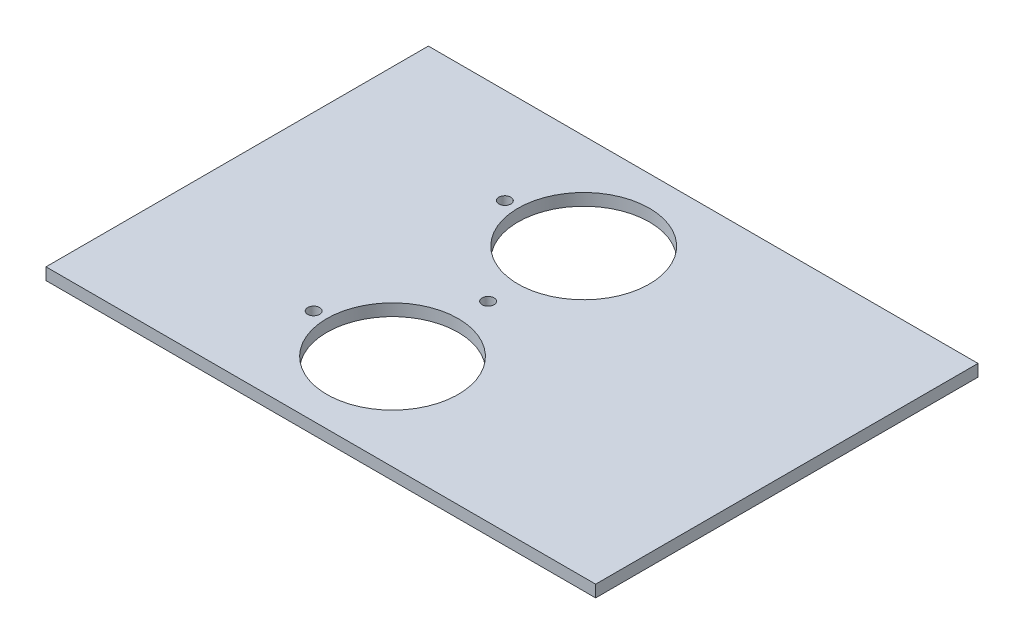
ISO-10303-21;
HEADER;
FILE_DESCRIPTION(('STEP AP214'),'2;1');
FILE_NAME('part.step','',(''),(''),'','','');
FILE_SCHEMA(('AUTOMOTIVE_DESIGN { 1 0 10303 214 1 1 1 1 }'));
ENDSEC;
DATA;
#1=APPLICATION_CONTEXT('core data for automotive mechanical design processes');
#2=APPLICATION_PROTOCOL_DEFINITION('international standard','automotive_design',2000,#1);
#3=PRODUCT_CONTEXT('',#1,'mechanical');
#4=PRODUCT('Part','Part','',(#3));
#5=PRODUCT_RELATED_PRODUCT_CATEGORY('part','',(#4));
#6=PRODUCT_DEFINITION_FORMATION('','',#4);
#7=PRODUCT_DEFINITION_CONTEXT('part definition',#1,'design');
#8=PRODUCT_DEFINITION('design','',#6,#7);
#9=PRODUCT_DEFINITION_SHAPE('','',#8);
#10=(LENGTH_UNIT() NAMED_UNIT(*) SI_UNIT(.MILLI.,.METRE.));
#11=(NAMED_UNIT(*) PLANE_ANGLE_UNIT() SI_UNIT($,.RADIAN.));
#12=(NAMED_UNIT(*) SI_UNIT($,.STERADIAN.) SOLID_ANGLE_UNIT());
#13=UNCERTAINTY_MEASURE_WITH_UNIT(LENGTH_MEASURE(1.E-05),#10,'distance_accuracy_value','');
#14=(GEOMETRIC_REPRESENTATION_CONTEXT(3) GLOBAL_UNCERTAINTY_ASSIGNED_CONTEXT((#13)) GLOBAL_UNIT_ASSIGNED_CONTEXT((#10,
#11,#12)) REPRESENTATION_CONTEXT('',''));
#15=CARTESIAN_POINT('',(0.,0.,0.));
#16=DIRECTION('',(0.,0.,1.));
#17=DIRECTION('',(1.,0.,0.));
#18=AXIS2_PLACEMENT_3D('',#15,#16,#17);
#19=CARTESIAN_POINT('',(125.,5.,80.));
#20=DIRECTION('',(-1.,0.,0.));
#21=DIRECTION('',(0.,0.,1.));
#22=AXIS2_PLACEMENT_3D('',#19,#20,#21);
#23=PLANE('',#22);
#24=DIRECTION('',(0.,0.,-1.));
#25=VECTOR('',#24,1.);
#26=CARTESIAN_POINT('',(125.,0.,80.));
#27=LINE('',#26,#25);
#28=CARTESIAN_POINT('',(125.,0.,80.));
#29=VERTEX_POINT('',#28);
#30=CARTESIAN_POINT('',(125.,0.,-80.));
#31=VERTEX_POINT('',#30);
#32=EDGE_CURVE('E91',#29,#31,#27,.T.);
#33=ORIENTED_EDGE('',*,*,#32,.T.);
#34=DIRECTION('',(0.,-1.,0.));
#35=VECTOR('',#34,1.);
#36=CARTESIAN_POINT('',(125.,5.,-80.));
#37=LINE('',#36,#35);
#38=CARTESIAN_POINT('',(125.,5.,-80.));
#39=VERTEX_POINT('',#38);
#40=EDGE_CURVE('E11',#39,#31,#37,.T.);
#41=ORIENTED_EDGE('',*,*,#40,.F.);
#42=DIRECTION('',(0.,0.,-1.));
#43=VECTOR('',#42,1.);
#44=CARTESIAN_POINT('',(125.,5.,80.));
#45=LINE('',#44,#43);
#46=CARTESIAN_POINT('',(125.,5.,80.));
#47=VERTEX_POINT('',#46);
#48=EDGE_CURVE('E85',#47,#39,#45,.T.);
#49=ORIENTED_EDGE('',*,*,#48,.F.);
#50=DIRECTION('',(0.,-1.,0.));
#51=VECTOR('',#50,1.);
#52=CARTESIAN_POINT('',(125.,5.,80.));
#53=LINE('',#52,#51);
#54=EDGE_CURVE('E46',#47,#29,#53,.T.);
#55=ORIENTED_EDGE('',*,*,#54,.T.);
#56=EDGE_LOOP('',(#33,#41,#49,#55));
#57=FACE_BOUND('',#56,.T.);
#58=ADVANCED_FACE('F39',(#57),#23,.F.);
#59=CARTESIAN_POINT('',(-125.,5.,-80.));
#60=DIRECTION('',(0.,0.,1.));
#61=DIRECTION('',(1.,0.,0.));
#62=AXIS2_PLACEMENT_3D('',#59,#60,#61);
#63=PLANE('',#62);
#64=DIRECTION('',(-1.,0.,0.));
#65=VECTOR('',#64,1.);
#66=CARTESIAN_POINT('',(-125.,0.,-80.));
#67=LINE('',#66,#65);
#68=CARTESIAN_POINT('',(-105.,0.,-80.));
#69=VERTEX_POINT('',#68);
#70=EDGE_CURVE('E86',#31,#69,#67,.T.);
#71=ORIENTED_EDGE('',*,*,#70,.T.);
#72=DIRECTION('',(0.,-1.,0.));
#73=VECTOR('',#72,1.);
#74=CARTESIAN_POINT('',(-105.,5.001,-80.));
#75=LINE('',#74,#73);
#76=CARTESIAN_POINT('',(-105.,5.,-80.));
#77=VERTEX_POINT('',#76);
#78=EDGE_CURVE('E53',#77,#69,#75,.T.);
#79=ORIENTED_EDGE('',*,*,#78,.F.);
#80=DIRECTION('',(-1.,0.,0.));
#81=VECTOR('',#80,1.);
#82=CARTESIAN_POINT('',(-125.,5.,-80.));
#83=LINE('',#82,#81);
#84=EDGE_CURVE('E103',#39,#77,#83,.T.);
#85=ORIENTED_EDGE('',*,*,#84,.F.);
#86=ORIENTED_EDGE('',*,*,#40,.T.);
#87=EDGE_LOOP('',(#71,#79,#85,#86));
#88=FACE_BOUND('',#87,.T.);
#89=ADVANCED_FACE('F151',(#88),#63,.F.);
#90=CARTESIAN_POINT('',(-125.,5.,80.));
#91=DIRECTION('',(0.,0.,-1.));
#92=DIRECTION('',(-1.,0.,0.));
#93=AXIS2_PLACEMENT_3D('',#90,#91,#92);
#94=PLANE('',#93);
#95=DIRECTION('',(1.,0.,0.));
#96=VECTOR('',#95,1.);
#97=CARTESIAN_POINT('',(-125.,5.,80.));
#98=LINE('',#97,#96);
#99=CARTESIAN_POINT('',(-105.,5.,80.));
#100=VERTEX_POINT('',#99);
#101=EDGE_CURVE('E62',#100,#47,#98,.T.);
#102=ORIENTED_EDGE('',*,*,#101,.F.);
#103=DIRECTION('',(0.,-1.,0.));
#104=VECTOR('',#103,1.);
#105=CARTESIAN_POINT('',(-105.,5.001,80.));
#106=LINE('',#105,#104);
#107=CARTESIAN_POINT('',(-105.,0.,80.));
#108=VERTEX_POINT('',#107);
#109=EDGE_CURVE('E82',#100,#108,#106,.T.);
#110=ORIENTED_EDGE('',*,*,#109,.T.);
#111=DIRECTION('',(1.,0.,0.));
#112=VECTOR('',#111,1.);
#113=CARTESIAN_POINT('',(-125.,0.,80.));
#114=LINE('',#113,#112);
#115=EDGE_CURVE('E76',#108,#29,#114,.T.);
#116=ORIENTED_EDGE('',*,*,#115,.T.);
#117=ORIENTED_EDGE('',*,*,#54,.F.);
#118=EDGE_LOOP('',(#102,#110,#116,#117));
#119=FACE_BOUND('',#118,.T.);
#120=ADVANCED_FACE('F78',(#119),#94,.F.);
#121=CARTESIAN_POINT('',(0.,5.,0.));
#122=DIRECTION('',(0.,-1.,0.));
#123=DIRECTION('',(0.,0.,-1.));
#124=AXIS2_PLACEMENT_3D('',#121,#122,#123);
#125=PLANE('',#124);
#126=CARTESIAN_POINT('',(0.,5.,40.));
#127=DIRECTION('',(0.,-1.,0.));
#128=DIRECTION('',(0.,0.,-1.));
#129=AXIS2_PLACEMENT_3D('',#126,#127,#128);
#130=CIRCLE('',#129,27.5);
#131=CARTESIAN_POINT('',(0.,5.,12.5));
#132=VERTEX_POINT('',#131);
#133=EDGE_CURVE('E126',#132,#132,#130,.F.);
#134=ORIENTED_EDGE('',*,*,#133,.F.);
#135=EDGE_LOOP('',(#134));
#136=FACE_BOUND('',#135,.T.);
#137=CARTESIAN_POINT('',(-32.9999999999999,5.,40.));
#138=DIRECTION('',(0.,-1.,0.));
#139=DIRECTION('',(0.,0.,-1.));
#140=AXIS2_PLACEMENT_3D('',#137,#138,#139);
#141=CIRCLE('',#140,2.5);
#142=CARTESIAN_POINT('',(-32.9999999999999,5.,37.5));
#143=VERTEX_POINT('',#142);
#144=EDGE_CURVE('E125',#143,#143,#141,.F.);
#145=ORIENTED_EDGE('',*,*,#144,.F.);
#146=EDGE_LOOP('',(#145));
#147=FACE_BOUND('',#146,.T.);
#148=CARTESIAN_POINT('',(-33.,5.,-40.));
#149=DIRECTION('',(0.,-1.,0.));
#150=DIRECTION('',(0.,0.,-1.));
#151=AXIS2_PLACEMENT_3D('',#148,#149,#150);
#152=CIRCLE('',#151,2.5);
#153=CARTESIAN_POINT('',(-33.,5.,-42.5));
#154=VERTEX_POINT('',#153);
#155=EDGE_CURVE('E112',#154,#154,#152,.F.);
#156=ORIENTED_EDGE('',*,*,#155,.F.);
#157=EDGE_LOOP('',(#156));
#158=FACE_BOUND('',#157,.T.);
#159=CARTESIAN_POINT('',(0.,5.,0.));
#160=DIRECTION('',(0.,-1.,0.));
#161=DIRECTION('',(0.,0.,-1.));
#162=AXIS2_PLACEMENT_3D('',#159,#160,#161);
#163=CIRCLE('',#162,2.5);
#164=CARTESIAN_POINT('',(0.,5.,-2.5));
#165=VERTEX_POINT('',#164);
#166=EDGE_CURVE('E136',#165,#165,#163,.F.);
#167=ORIENTED_EDGE('',*,*,#166,.F.);
#168=EDGE_LOOP('',(#167));
#169=FACE_BOUND('',#168,.T.);
#170=CARTESIAN_POINT('',(0.,5.,-40.));
#171=DIRECTION('',(0.,-1.,0.));
#172=DIRECTION('',(0.,0.,-1.));
#173=AXIS2_PLACEMENT_3D('',#170,#171,#172);
#174=CIRCLE('',#173,27.5);
#175=CARTESIAN_POINT('',(0.,5.,-67.5));
#176=VERTEX_POINT('',#175);
#177=EDGE_CURVE('E95',#176,#176,#174,.F.);
#178=ORIENTED_EDGE('',*,*,#177,.F.);
#179=EDGE_LOOP('',(#178));
#180=FACE_BOUND('',#179,.T.);
#181=ORIENTED_EDGE('',*,*,#84,.T.);
#182=DIRECTION('',(0.,0.,-1.));
#183=VECTOR('',#182,1.);
#184=CARTESIAN_POINT('',(-105.,5.,-80.));
#185=LINE('',#184,#183);
#186=EDGE_CURVE('E110',#100,#77,#185,.T.);
#187=ORIENTED_EDGE('',*,*,#186,.F.);
#188=ORIENTED_EDGE('',*,*,#101,.T.);
#189=ORIENTED_EDGE('',*,*,#48,.T.);
#190=EDGE_LOOP('',(#181,#187,#188,#189));
#191=FACE_BOUND('',#190,.T.);
#192=ADVANCED_FACE('F142',(#136,#147,#158,#169,#180,#191),#125,.F.);
#193=CARTESIAN_POINT('',(0.,0.,0.));
#194=DIRECTION('',(0.,-1.,0.));
#195=DIRECTION('',(0.,0.,-1.));
#196=AXIS2_PLACEMENT_3D('',#193,#194,#195);
#197=PLANE('',#196);
#198=CARTESIAN_POINT('',(0.,0.,40.));
#199=DIRECTION('',(0.,-1.,0.));
#200=DIRECTION('',(0.,0.,1.));
#201=AXIS2_PLACEMENT_3D('',#198,#199,#200);
#202=CIRCLE('',#201,27.5);
#203=CARTESIAN_POINT('',(0.,0.,67.5));
#204=VERTEX_POINT('',#203);
#205=EDGE_CURVE('E122',#204,#204,#202,.T.);
#206=ORIENTED_EDGE('',*,*,#205,.F.);
#207=EDGE_LOOP('',(#206));
#208=FACE_BOUND('',#207,.T.);
#209=CARTESIAN_POINT('',(-32.9999999999999,0.,40.));
#210=DIRECTION('',(0.,-1.,0.));
#211=DIRECTION('',(0.,0.,1.));
#212=AXIS2_PLACEMENT_3D('',#209,#210,#211);
#213=CIRCLE('',#212,2.5);
#214=CARTESIAN_POINT('',(-32.9999999999999,0.,42.5));
#215=VERTEX_POINT('',#214);
#216=EDGE_CURVE('E116',#215,#215,#213,.T.);
#217=ORIENTED_EDGE('',*,*,#216,.F.);
#218=EDGE_LOOP('',(#217));
#219=FACE_BOUND('',#218,.T.);
#220=DIRECTION('',(0.,0.,1.));
#221=VECTOR('',#220,1.);
#222=CARTESIAN_POINT('',(-105.,0.,-80.));
#223=LINE('',#222,#221);
#224=EDGE_CURVE('E113',#69,#108,#223,.T.);
#225=ORIENTED_EDGE('',*,*,#224,.F.);
#226=ORIENTED_EDGE('',*,*,#70,.F.);
#227=ORIENTED_EDGE('',*,*,#32,.F.);
#228=ORIENTED_EDGE('',*,*,#115,.F.);
#229=EDGE_LOOP('',(#225,#226,#227,#228));
#230=FACE_BOUND('',#229,.T.);
#231=CARTESIAN_POINT('',(-33.,0.,-40.));
#232=DIRECTION('',(0.,-1.,0.));
#233=DIRECTION('',(0.,0.,-1.));
#234=AXIS2_PLACEMENT_3D('',#231,#232,#233);
#235=CIRCLE('',#234,2.5);
#236=CARTESIAN_POINT('',(-33.,0.,-42.5));
#237=VERTEX_POINT('',#236);
#238=EDGE_CURVE('E109',#237,#237,#235,.T.);
#239=ORIENTED_EDGE('',*,*,#238,.F.);
#240=EDGE_LOOP('',(#239));
#241=FACE_BOUND('',#240,.T.);
#242=CARTESIAN_POINT('',(0.,0.,0.));
#243=DIRECTION('',(0.,-1.,0.));
#244=DIRECTION('',(0.,0.,-1.));
#245=AXIS2_PLACEMENT_3D('',#242,#243,#244);
#246=CIRCLE('',#245,2.5);
#247=CARTESIAN_POINT('',(0.,0.,-2.5));
#248=VERTEX_POINT('',#247);
#249=EDGE_CURVE('E129',#248,#248,#246,.T.);
#250=ORIENTED_EDGE('',*,*,#249,.F.);
#251=EDGE_LOOP('',(#250));
#252=FACE_BOUND('',#251,.T.);
#253=CARTESIAN_POINT('',(0.,0.,-40.));
#254=DIRECTION('',(0.,-1.,0.));
#255=DIRECTION('',(0.,0.,-1.));
#256=AXIS2_PLACEMENT_3D('',#253,#254,#255);
#257=CIRCLE('',#256,27.5);
#258=CARTESIAN_POINT('',(0.,0.,-67.5));
#259=VERTEX_POINT('',#258);
#260=EDGE_CURVE('E99',#259,#259,#257,.T.);
#261=ORIENTED_EDGE('',*,*,#260,.F.);
#262=EDGE_LOOP('',(#261));
#263=FACE_BOUND('',#262,.T.);
#264=ADVANCED_FACE('F92',(#208,#219,#230,#241,#252,#263),#197,.T.);
#265=CARTESIAN_POINT('',(0.,5.001,-40.));
#266=DIRECTION('',(0.,-1.,0.));
#267=DIRECTION('',(0.,0.,-1.));
#268=AXIS2_PLACEMENT_3D('',#265,#266,#267);
#269=CYLINDRICAL_SURFACE('',#268,27.5);
#270=ORIENTED_EDGE('',*,*,#260,.T.);
#271=EDGE_LOOP('',(#270));
#272=FACE_BOUND('',#271,.T.);
#273=ORIENTED_EDGE('',*,*,#177,.T.);
#274=EDGE_LOOP('',(#273));
#275=FACE_BOUND('',#274,.T.);
#276=ADVANCED_FACE('F160',(#272,#275),#269,.F.);
#277=CARTESIAN_POINT('',(0.,5.001,0.));
#278=DIRECTION('',(0.,-1.,0.));
#279=DIRECTION('',(0.,0.,-1.));
#280=AXIS2_PLACEMENT_3D('',#277,#278,#279);
#281=CYLINDRICAL_SURFACE('',#280,2.5);
#282=ORIENTED_EDGE('',*,*,#249,.T.);
#283=EDGE_LOOP('',(#282));
#284=FACE_BOUND('',#283,.T.);
#285=ORIENTED_EDGE('',*,*,#166,.T.);
#286=EDGE_LOOP('',(#285));
#287=FACE_BOUND('',#286,.T.);
#288=ADVANCED_FACE('F140',(#284,#287),#281,.F.);
#289=CARTESIAN_POINT('',(-33.,5.001,-40.));
#290=DIRECTION('',(0.,-1.,0.));
#291=DIRECTION('',(0.,0.,-1.));
#292=AXIS2_PLACEMENT_3D('',#289,#290,#291);
#293=CYLINDRICAL_SURFACE('',#292,2.5);
#294=ORIENTED_EDGE('',*,*,#238,.T.);
#295=EDGE_LOOP('',(#294));
#296=FACE_BOUND('',#295,.T.);
#297=ORIENTED_EDGE('',*,*,#155,.T.);
#298=EDGE_LOOP('',(#297));
#299=FACE_BOUND('',#298,.T.);
#300=ADVANCED_FACE('F170',(#296,#299),#293,.F.);
#301=CARTESIAN_POINT('',(-105.,5.001,-80.));
#302=DIRECTION('',(1.,0.,0.));
#303=DIRECTION('',(0.,0.,-1.));
#304=AXIS2_PLACEMENT_3D('',#301,#302,#303);
#305=PLANE('',#304);
#306=ORIENTED_EDGE('',*,*,#186,.T.);
#307=ORIENTED_EDGE('',*,*,#78,.T.);
#308=ORIENTED_EDGE('',*,*,#224,.T.);
#309=ORIENTED_EDGE('',*,*,#109,.F.);
#310=EDGE_LOOP('',(#306,#307,#308,#309));
#311=FACE_BOUND('',#310,.T.);
#312=ADVANCED_FACE('F166',(#311),#305,.F.);
#313=CARTESIAN_POINT('',(-32.9999999999999,5.001,40.));
#314=DIRECTION('',(0.,-1.,0.));
#315=DIRECTION('',(0.,0.,-1.));
#316=AXIS2_PLACEMENT_3D('',#313,#314,#315);
#317=CYLINDRICAL_SURFACE('',#316,2.5);
#318=ORIENTED_EDGE('',*,*,#216,.T.);
#319=EDGE_LOOP('',(#318));
#320=FACE_BOUND('',#319,.T.);
#321=ORIENTED_EDGE('',*,*,#144,.T.);
#322=EDGE_LOOP('',(#321));
#323=FACE_BOUND('',#322,.T.);
#324=ADVANCED_FACE('F169',(#320,#323),#317,.F.);
#325=CARTESIAN_POINT('',(0.,5.001,40.));
#326=DIRECTION('',(0.,-1.,0.));
#327=DIRECTION('',(0.,0.,-1.));
#328=AXIS2_PLACEMENT_3D('',#325,#326,#327);
#329=CYLINDRICAL_SURFACE('',#328,27.5);
#330=ORIENTED_EDGE('',*,*,#205,.T.);
#331=EDGE_LOOP('',(#330));
#332=FACE_BOUND('',#331,.T.);
#333=ORIENTED_EDGE('',*,*,#133,.T.);
#334=EDGE_LOOP('',(#333));
#335=FACE_BOUND('',#334,.T.);
#336=ADVANCED_FACE('F174',(#332,#335),#329,.F.);
#337=CLOSED_SHELL('',(#58,#89,#120,#192,#264,#276,#288,#300,#312,#324,#336));
#338=MANIFOLD_SOLID_BREP('B2',#337);
#339=ADVANCED_BREP_SHAPE_REPRESENTATION('',(#18,#338),#14);
#340=SHAPE_DEFINITION_REPRESENTATION(#9,#339);
ENDSEC;
END-ISO-10303-21;
